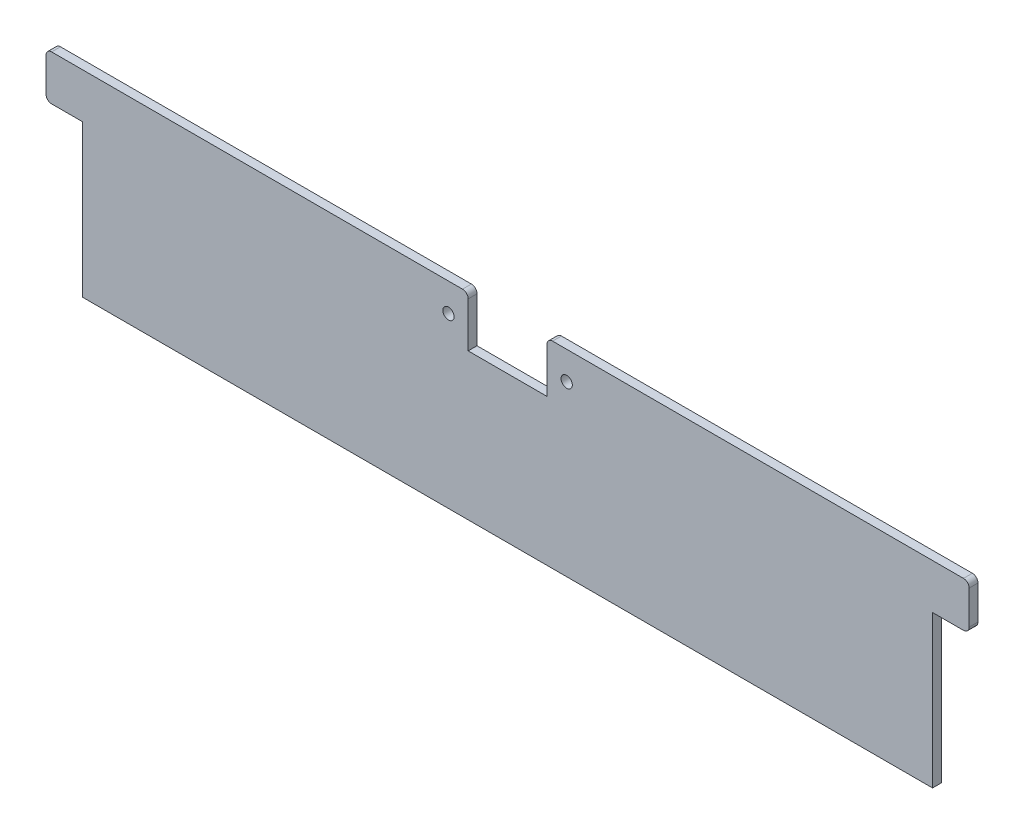
ISO-10303-21;
HEADER;
FILE_DESCRIPTION(('STEP AP214'),'2;1');
FILE_NAME('part.step','',(''),(''),'','','');
FILE_SCHEMA(('AUTOMOTIVE_DESIGN { 1 0 10303 214 1 1 1 1 }'));
ENDSEC;
DATA;
#1=APPLICATION_CONTEXT('core data for automotive mechanical design processes');
#2=APPLICATION_PROTOCOL_DEFINITION('international standard','automotive_design',2000,#1);
#3=PRODUCT_CONTEXT('',#1,'mechanical');
#4=PRODUCT('Part','Part','',(#3));
#5=PRODUCT_RELATED_PRODUCT_CATEGORY('part','',(#4));
#6=PRODUCT_DEFINITION_FORMATION('','',#4);
#7=PRODUCT_DEFINITION_CONTEXT('part definition',#1,'design');
#8=PRODUCT_DEFINITION('design','',#6,#7);
#9=PRODUCT_DEFINITION_SHAPE('','',#8);
#10=(LENGTH_UNIT() NAMED_UNIT(*) SI_UNIT(.MILLI.,.METRE.));
#11=(NAMED_UNIT(*) PLANE_ANGLE_UNIT() SI_UNIT($,.RADIAN.));
#12=(NAMED_UNIT(*) SI_UNIT($,.STERADIAN.) SOLID_ANGLE_UNIT());
#13=UNCERTAINTY_MEASURE_WITH_UNIT(LENGTH_MEASURE(1.E-05),#10,'distance_accuracy_value','');
#14=(GEOMETRIC_REPRESENTATION_CONTEXT(3) GLOBAL_UNCERTAINTY_ASSIGNED_CONTEXT((#13)) GLOBAL_UNIT_ASSIGNED_CONTEXT((#10,
#11,#12)) REPRESENTATION_CONTEXT('',''));
#15=CARTESIAN_POINT('',(0.,0.,0.));
#16=DIRECTION('',(0.,0.,1.));
#17=DIRECTION('',(1.,0.,0.));
#18=AXIS2_PLACEMENT_3D('',#15,#16,#17);
#19=CARTESIAN_POINT('',(0.,0.,2.5));
#20=DIRECTION('',(0.,0.,-1.));
#21=DIRECTION('',(-1.,0.,0.));
#22=AXIS2_PLACEMENT_3D('',#19,#20,#21);
#23=PLANE('',#22);
#24=CARTESIAN_POINT('',(-33.3375,52.3875000000003,2.5));
#25=DIRECTION('',(0.,0.,1.));
#26=DIRECTION('',(1.,0.,0.));
#27=AXIS2_PLACEMENT_3D('',#24,#25,#26);
#28=CIRCLE('',#27,3.17499999999999);
#29=CARTESIAN_POINT('',(-30.1625,52.3875000000003,2.5));
#30=VERTEX_POINT('',#29);
#31=EDGE_CURVE('E477',#30,#30,#28,.T.);
#32=ORIENTED_EDGE('',*,*,#31,.F.);
#33=EDGE_LOOP('',(#32));
#34=FACE_BOUND('',#33,.T.);
#35=DIRECTION('',(-1.,0.,0.));
#36=VECTOR('',#35,1.);
#37=CARTESIAN_POINT('',(-260.35,68.2625000000003,2.5));
#38=LINE('',#37,#36);
#39=CARTESIAN_POINT('',(257.175,68.2625000000003,2.5));
#40=VERTEX_POINT('',#39);
#41=CARTESIAN_POINT('',(25.4,68.2625000000003,2.5));
#42=VERTEX_POINT('',#41);
#43=EDGE_CURVE('E213',#40,#42,#38,.T.);
#44=ORIENTED_EDGE('',*,*,#43,.T.);
#45=CARTESIAN_POINT('',(25.4,65.0875000000003,2.5));
#46=DIRECTION('',(0.,0.,-1.));
#47=DIRECTION('',(-1.,0.,0.));
#48=AXIS2_PLACEMENT_3D('',#45,#46,#47);
#49=CIRCLE('',#48,3.175);
#50=CARTESIAN_POINT('',(22.225,65.0875000000002,2.5));
#51=VERTEX_POINT('',#50);
#52=EDGE_CURVE('E260',#42,#51,#49,.F.);
#53=ORIENTED_EDGE('',*,*,#52,.T.);
#54=DIRECTION('',(0.,1.,0.));
#55=VECTOR('',#54,1.);
#56=CARTESIAN_POINT('',(22.225,39.6875000000002,2.5));
#57=LINE('',#56,#55);
#58=CARTESIAN_POINT('',(22.225,39.6875000000002,2.5));
#59=VERTEX_POINT('',#58);
#60=EDGE_CURVE('E186',#59,#51,#57,.T.);
#61=ORIENTED_EDGE('',*,*,#60,.F.);
#62=DIRECTION('',(1.,0.,0.));
#63=VECTOR('',#62,1.);
#64=CARTESIAN_POINT('',(-22.225,39.6875000000002,2.5));
#65=LINE('',#64,#63);
#66=CARTESIAN_POINT('',(-22.225,39.6875000000002,2.5));
#67=VERTEX_POINT('',#66);
#68=EDGE_CURVE('E166',#67,#59,#65,.T.);
#69=ORIENTED_EDGE('',*,*,#68,.F.);
#70=DIRECTION('',(0.,-1.,0.));
#71=VECTOR('',#70,1.);
#72=CARTESIAN_POINT('',(-22.225,39.6875000000002,2.5));
#73=LINE('',#72,#71);
#74=CARTESIAN_POINT('',(-22.225,65.0875000000002,2.5));
#75=VERTEX_POINT('',#74);
#76=EDGE_CURVE('E188',#75,#67,#73,.T.);
#77=ORIENTED_EDGE('',*,*,#76,.F.);
#78=CARTESIAN_POINT('',(-25.4,65.0875000000003,2.5));
#79=DIRECTION('',(0.,0.,-1.));
#80=DIRECTION('',(-1.,0.,0.));
#81=AXIS2_PLACEMENT_3D('',#78,#79,#80);
#82=CIRCLE('',#81,3.175);
#83=CARTESIAN_POINT('',(-25.4,68.2625000000003,2.5));
#84=VERTEX_POINT('',#83);
#85=EDGE_CURVE('E258',#75,#84,#82,.F.);
#86=ORIENTED_EDGE('',*,*,#85,.T.);
#87=CARTESIAN_POINT('',(-257.175,68.2625000000003,2.5));
#88=VERTEX_POINT('',#87);
#89=EDGE_CURVE('E210',#84,#88,#38,.T.);
#90=ORIENTED_EDGE('',*,*,#89,.T.);
#91=CARTESIAN_POINT('',(-257.175,65.0875000000003,2.5));
#92=DIRECTION('',(0.,0.,-1.));
#93=DIRECTION('',(-1.,0.,0.));
#94=AXIS2_PLACEMENT_3D('',#91,#92,#93);
#95=CIRCLE('',#94,3.175);
#96=CARTESIAN_POINT('',(-260.35,65.0875000000003,2.5));
#97=VERTEX_POINT('',#96);
#98=EDGE_CURVE('E254',#88,#97,#95,.F.);
#99=ORIENTED_EDGE('',*,*,#98,.T.);
#100=DIRECTION('',(0.,-1.,0.));
#101=VECTOR('',#100,1.);
#102=CARTESIAN_POINT('',(-260.35,42.8625000000003,2.5));
#103=LINE('',#102,#101);
#104=CARTESIAN_POINT('',(-260.35,46.0375000000002,2.5));
#105=VERTEX_POINT('',#104);
#106=EDGE_CURVE('E192',#97,#105,#103,.T.);
#107=ORIENTED_EDGE('',*,*,#106,.T.);
#108=CARTESIAN_POINT('',(-257.175,46.0375000000002,2.5));
#109=DIRECTION('',(0.,0.,-1.));
#110=DIRECTION('',(-1.,0.,0.));
#111=AXIS2_PLACEMENT_3D('',#108,#109,#110);
#112=CIRCLE('',#111,3.175);
#113=CARTESIAN_POINT('',(-257.175,42.8625000000002,2.5));
#114=VERTEX_POINT('',#113);
#115=EDGE_CURVE('E256',#105,#114,#112,.F.);
#116=ORIENTED_EDGE('',*,*,#115,.T.);
#117=DIRECTION('',(1.,0.,0.));
#118=VECTOR('',#117,1.);
#119=CARTESIAN_POINT('',(-239.7125,42.8625,2.5));
#120=LINE('',#119,#118);
#121=CARTESIAN_POINT('',(-239.7125,42.8625,2.5));
#122=VERTEX_POINT('',#121);
#123=EDGE_CURVE('E195',#114,#122,#120,.T.);
#124=ORIENTED_EDGE('',*,*,#123,.T.);
#125=DIRECTION('',(0.,-1.,0.));
#126=VECTOR('',#125,1.);
#127=CARTESIAN_POINT('',(-239.7125,-42.8625,2.5));
#128=LINE('',#127,#126);
#129=CARTESIAN_POINT('',(-239.7125,-42.8625,2.5));
#130=VERTEX_POINT('',#129);
#131=EDGE_CURVE('E198',#122,#130,#128,.T.);
#132=ORIENTED_EDGE('',*,*,#131,.T.);
#133=DIRECTION('',(1.,0.,0.));
#134=VECTOR('',#133,1.);
#135=CARTESIAN_POINT('',(239.7125,-42.8625,2.5));
#136=LINE('',#135,#134);
#137=CARTESIAN_POINT('',(239.7125,-42.8625,2.5));
#138=VERTEX_POINT('',#137);
#139=EDGE_CURVE('E200',#130,#138,#136,.T.);
#140=ORIENTED_EDGE('',*,*,#139,.T.);
#141=DIRECTION('',(0.,1.,0.));
#142=VECTOR('',#141,1.);
#143=CARTESIAN_POINT('',(239.7125,42.8625,2.5));
#144=LINE('',#143,#142);
#145=CARTESIAN_POINT('',(239.7125,42.8625,2.5));
#146=VERTEX_POINT('',#145);
#147=EDGE_CURVE('E202',#138,#146,#144,.T.);
#148=ORIENTED_EDGE('',*,*,#147,.T.);
#149=DIRECTION('',(1.,0.,0.));
#150=VECTOR('',#149,1.);
#151=CARTESIAN_POINT('',(260.35,42.8625000000003,2.5));
#152=LINE('',#151,#150);
#153=CARTESIAN_POINT('',(257.175,42.8625000000002,2.5));
#154=VERTEX_POINT('',#153);
#155=EDGE_CURVE('E204',#146,#154,#152,.T.);
#156=ORIENTED_EDGE('',*,*,#155,.T.);
#157=CARTESIAN_POINT('',(257.175,46.0375000000002,2.5));
#158=DIRECTION('',(0.,0.,-1.));
#159=DIRECTION('',(-1.,0.,0.));
#160=AXIS2_PLACEMENT_3D('',#157,#158,#159);
#161=CIRCLE('',#160,3.175);
#162=CARTESIAN_POINT('',(260.35,46.0375000000002,2.5));
#163=VERTEX_POINT('',#162);
#164=EDGE_CURVE('E250',#154,#163,#161,.F.);
#165=ORIENTED_EDGE('',*,*,#164,.T.);
#166=DIRECTION('',(0.,1.,0.));
#167=VECTOR('',#166,1.);
#168=CARTESIAN_POINT('',(260.35,68.2625000000003,2.5));
#169=LINE('',#168,#167);
#170=CARTESIAN_POINT('',(260.35,65.0875000000003,2.5));
#171=VERTEX_POINT('',#170);
#172=EDGE_CURVE('E207',#163,#171,#169,.T.);
#173=ORIENTED_EDGE('',*,*,#172,.T.);
#174=CARTESIAN_POINT('',(257.175,65.0875000000003,2.5));
#175=DIRECTION('',(0.,0.,-1.));
#176=DIRECTION('',(-1.,0.,0.));
#177=AXIS2_PLACEMENT_3D('',#174,#175,#176);
#178=CIRCLE('',#177,3.175);
#179=EDGE_CURVE('E252',#171,#40,#178,.F.);
#180=ORIENTED_EDGE('',*,*,#179,.T.);
#181=EDGE_LOOP('',(#44,#53,#61,#69,#77,#86,#90,#99,#107,#116,#124,#132,#140,#148,#156,#165,#173,#180));
#182=FACE_BOUND('',#181,.T.);
#183=CARTESIAN_POINT('',(33.3375,52.3875000000003,2.5));
#184=DIRECTION('',(0.,0.,1.));
#185=DIRECTION('',(1.,0.,0.));
#186=AXIS2_PLACEMENT_3D('',#183,#184,#185);
#187=CIRCLE('',#186,3.17499999999999);
#188=CARTESIAN_POINT('',(36.5125,52.3875000000003,2.5));
#189=VERTEX_POINT('',#188);
#190=EDGE_CURVE('E479',#189,#189,#187,.T.);
#191=ORIENTED_EDGE('',*,*,#190,.F.);
#192=EDGE_LOOP('',(#191));
#193=FACE_BOUND('',#192,.T.);
#194=ADVANCED_FACE('F34',(#34,#182,#193),#23,.F.);
#195=CARTESIAN_POINT('',(-260.35,68.2625000000003,2.5));
#196=DIRECTION('',(0.,-1.,0.));
#197=DIRECTION('',(0.,0.,-1.));
#198=AXIS2_PLACEMENT_3D('',#195,#196,#197);
#199=PLANE('',#198);
#200=DIRECTION('',(-1.,0.,0.));
#201=VECTOR('',#200,1.);
#202=CARTESIAN_POINT('',(-260.35,68.2625000000003,-2.5));
#203=LINE('',#202,#201);
#204=CARTESIAN_POINT('',(257.175,68.2625000000003,-2.5));
#205=VERTEX_POINT('',#204);
#206=CARTESIAN_POINT('',(25.4,68.2625000000003,-2.5));
#207=VERTEX_POINT('',#206);
#208=EDGE_CURVE('E196',#205,#207,#203,.T.);
#209=ORIENTED_EDGE('',*,*,#208,.T.);
#210=DIRECTION('',(0.,0.,1.));
#211=VECTOR('',#210,1.);
#212=CARTESIAN_POINT('',(25.4,68.2625000000003,2.5));
#213=LINE('',#212,#211);
#214=EDGE_CURVE('E247',#207,#42,#213,.T.);
#215=ORIENTED_EDGE('',*,*,#214,.T.);
#216=ORIENTED_EDGE('',*,*,#43,.F.);
#217=DIRECTION('',(0.,0.,-1.));
#218=VECTOR('',#217,1.);
#219=CARTESIAN_POINT('',(257.175,68.2625000000003,2.5));
#220=LINE('',#219,#218);
#221=EDGE_CURVE('E244',#40,#205,#220,.T.);
#222=ORIENTED_EDGE('',*,*,#221,.T.);
#223=EDGE_LOOP('',(#209,#215,#216,#222));
#224=FACE_BOUND('',#223,.T.);
#225=ADVANCED_FACE('F308',(#224),#199,.F.);
#226=CARTESIAN_POINT('',(-260.35,42.8625000000003,2.5));
#227=DIRECTION('',(1.,0.,0.));
#228=DIRECTION('',(0.,0.,-1.));
#229=AXIS2_PLACEMENT_3D('',#226,#227,#228);
#230=PLANE('',#229);
#231=DIRECTION('',(0.,-1.,0.));
#232=VECTOR('',#231,1.);
#233=CARTESIAN_POINT('',(-260.35,42.8625000000003,-2.5));
#234=LINE('',#233,#232);
#235=CARTESIAN_POINT('',(-260.35,65.0875000000003,-2.5));
#236=VERTEX_POINT('',#235);
#237=CARTESIAN_POINT('',(-260.35,46.0375000000002,-2.5));
#238=VERTEX_POINT('',#237);
#239=EDGE_CURVE('E170',#236,#238,#234,.T.);
#240=ORIENTED_EDGE('',*,*,#239,.T.);
#241=DIRECTION('',(0.,0.,-1.));
#242=VECTOR('',#241,1.);
#243=CARTESIAN_POINT('',(-260.35,46.0375000000002,2.5));
#244=LINE('',#243,#242);
#245=EDGE_CURVE('E286',#238,#105,#244,.F.);
#246=ORIENTED_EDGE('',*,*,#245,.T.);
#247=ORIENTED_EDGE('',*,*,#106,.F.);
#248=DIRECTION('',(0.,0.,-1.));
#249=VECTOR('',#248,1.);
#250=CARTESIAN_POINT('',(-260.35,65.0875000000003,2.5));
#251=LINE('',#250,#249);
#252=EDGE_CURVE('E283',#97,#236,#251,.T.);
#253=ORIENTED_EDGE('',*,*,#252,.T.);
#254=EDGE_LOOP('',(#240,#246,#247,#253));
#255=FACE_BOUND('',#254,.T.);
#256=ADVANCED_FACE('F329',(#255),#230,.F.);
#257=CARTESIAN_POINT('',(-239.7125,42.8625,2.5));
#258=DIRECTION('',(0.,1.,0.));
#259=DIRECTION('',(-1.,0.,0.));
#260=AXIS2_PLACEMENT_3D('',#257,#258,#259);
#261=PLANE('',#260);
#262=ORIENTED_EDGE('',*,*,#123,.F.);
#263=DIRECTION('',(0.,0.,-1.));
#264=VECTOR('',#263,1.);
#265=CARTESIAN_POINT('',(-257.175,42.8625000000002,2.5));
#266=LINE('',#265,#264);
#267=CARTESIAN_POINT('',(-257.175,42.8625000000002,-2.5));
#268=VERTEX_POINT('',#267);
#269=EDGE_CURVE('E280',#114,#268,#266,.T.);
#270=ORIENTED_EDGE('',*,*,#269,.T.);
#271=DIRECTION('',(1.,0.,0.));
#272=VECTOR('',#271,1.);
#273=CARTESIAN_POINT('',(-239.7125,42.8625,-2.5));
#274=LINE('',#273,#272);
#275=CARTESIAN_POINT('',(-239.7125,42.8625,-2.5));
#276=VERTEX_POINT('',#275);
#277=EDGE_CURVE('E216',#268,#276,#274,.T.);
#278=ORIENTED_EDGE('',*,*,#277,.T.);
#279=DIRECTION('',(0.,0.,-1.));
#280=VECTOR('',#279,1.);
#281=CARTESIAN_POINT('',(-239.7125,42.8625,2.5));
#282=LINE('',#281,#280);
#283=EDGE_CURVE('E241',#122,#276,#282,.T.);
#284=ORIENTED_EDGE('',*,*,#283,.F.);
#285=EDGE_LOOP('',(#262,#270,#278,#284));
#286=FACE_BOUND('',#285,.T.);
#287=ADVANCED_FACE('F339',(#286),#261,.F.);
#288=CARTESIAN_POINT('',(-239.7125,-42.8625,2.5));
#289=DIRECTION('',(1.,0.,0.));
#290=DIRECTION('',(0.,0.,-1.));
#291=AXIS2_PLACEMENT_3D('',#288,#289,#290);
#292=PLANE('',#291);
#293=DIRECTION('',(0.,-1.,0.));
#294=VECTOR('',#293,1.);
#295=CARTESIAN_POINT('',(-239.7125,-42.8625,-2.5));
#296=LINE('',#295,#294);
#297=CARTESIAN_POINT('',(-239.7125,-42.8625,-2.5));
#298=VERTEX_POINT('',#297);
#299=EDGE_CURVE('E218',#276,#298,#296,.T.);
#300=ORIENTED_EDGE('',*,*,#299,.T.);
#301=DIRECTION('',(0.,0.,-1.));
#302=VECTOR('',#301,1.);
#303=CARTESIAN_POINT('',(-239.7125,-42.8625,2.5));
#304=LINE('',#303,#302);
#305=EDGE_CURVE('E238',#130,#298,#304,.T.);
#306=ORIENTED_EDGE('',*,*,#305,.F.);
#307=ORIENTED_EDGE('',*,*,#131,.F.);
#308=ORIENTED_EDGE('',*,*,#283,.T.);
#309=EDGE_LOOP('',(#300,#306,#307,#308));
#310=FACE_BOUND('',#309,.T.);
#311=ADVANCED_FACE('F346',(#310),#292,.F.);
#312=CARTESIAN_POINT('',(239.7125,-42.8625,2.5));
#313=DIRECTION('',(0.,1.,0.));
#314=DIRECTION('',(0.,0.,1.));
#315=AXIS2_PLACEMENT_3D('',#312,#313,#314);
#316=PLANE('',#315);
#317=DIRECTION('',(1.,0.,0.));
#318=VECTOR('',#317,1.);
#319=CARTESIAN_POINT('',(239.7125,-42.8625,-2.5));
#320=LINE('',#319,#318);
#321=CARTESIAN_POINT('',(239.7125,-42.8625,-2.5));
#322=VERTEX_POINT('',#321);
#323=EDGE_CURVE('E220',#298,#322,#320,.T.);
#324=ORIENTED_EDGE('',*,*,#323,.T.);
#325=DIRECTION('',(0.,0.,-1.));
#326=VECTOR('',#325,1.);
#327=CARTESIAN_POINT('',(239.7125,-42.8625,2.5));
#328=LINE('',#327,#326);
#329=EDGE_CURVE('E235',#138,#322,#328,.T.);
#330=ORIENTED_EDGE('',*,*,#329,.F.);
#331=ORIENTED_EDGE('',*,*,#139,.F.);
#332=ORIENTED_EDGE('',*,*,#305,.T.);
#333=EDGE_LOOP('',(#324,#330,#331,#332));
#334=FACE_BOUND('',#333,.T.);
#335=ADVANCED_FACE('F349',(#334),#316,.F.);
#336=CARTESIAN_POINT('',(239.7125,42.8625,2.5));
#337=DIRECTION('',(-1.,0.,0.));
#338=DIRECTION('',(0.,0.,1.));
#339=AXIS2_PLACEMENT_3D('',#336,#337,#338);
#340=PLANE('',#339);
#341=DIRECTION('',(0.,1.,0.));
#342=VECTOR('',#341,1.);
#343=CARTESIAN_POINT('',(239.7125,42.8625,-2.5));
#344=LINE('',#343,#342);
#345=CARTESIAN_POINT('',(239.7125,42.8625,-2.5));
#346=VERTEX_POINT('',#345);
#347=EDGE_CURVE('E222',#322,#346,#344,.T.);
#348=ORIENTED_EDGE('',*,*,#347,.T.);
#349=DIRECTION('',(0.,0.,-1.));
#350=VECTOR('',#349,1.);
#351=CARTESIAN_POINT('',(239.7125,42.8625,2.5));
#352=LINE('',#351,#350);
#353=EDGE_CURVE('E232',#146,#346,#352,.T.);
#354=ORIENTED_EDGE('',*,*,#353,.F.);
#355=ORIENTED_EDGE('',*,*,#147,.F.);
#356=ORIENTED_EDGE('',*,*,#329,.T.);
#357=EDGE_LOOP('',(#348,#354,#355,#356));
#358=FACE_BOUND('',#357,.T.);
#359=ADVANCED_FACE('F354',(#358),#340,.F.);
#360=CARTESIAN_POINT('',(260.35,42.8625000000003,2.5));
#361=DIRECTION('',(0.,1.,0.));
#362=DIRECTION('',(-1.,0.,0.));
#363=AXIS2_PLACEMENT_3D('',#360,#361,#362);
#364=PLANE('',#363);
#365=DIRECTION('',(1.,0.,0.));
#366=VECTOR('',#365,1.);
#367=CARTESIAN_POINT('',(260.35,42.8625000000003,-2.5));
#368=LINE('',#367,#366);
#369=CARTESIAN_POINT('',(257.175,42.8625000000002,-2.5));
#370=VERTEX_POINT('',#369);
#371=EDGE_CURVE('E224',#346,#370,#368,.T.);
#372=ORIENTED_EDGE('',*,*,#371,.T.);
#373=DIRECTION('',(0.,0.,-1.));
#374=VECTOR('',#373,1.);
#375=CARTESIAN_POINT('',(257.175,42.8625000000002,2.5));
#376=LINE('',#375,#374);
#377=EDGE_CURVE('E11',#370,#154,#376,.F.);
#378=ORIENTED_EDGE('',*,*,#377,.T.);
#379=ORIENTED_EDGE('',*,*,#155,.F.);
#380=ORIENTED_EDGE('',*,*,#353,.T.);
#381=EDGE_LOOP('',(#372,#378,#379,#380));
#382=FACE_BOUND('',#381,.T.);
#383=ADVANCED_FACE('F360',(#382),#364,.F.);
#384=CARTESIAN_POINT('',(260.35,68.2625000000003,2.5));
#385=DIRECTION('',(-1.,0.,0.));
#386=DIRECTION('',(0.,0.,1.));
#387=AXIS2_PLACEMENT_3D('',#384,#385,#386);
#388=PLANE('',#387);
#389=DIRECTION('',(0.,1.,0.));
#390=VECTOR('',#389,1.);
#391=CARTESIAN_POINT('',(260.35,68.2625000000003,-2.5));
#392=LINE('',#391,#390);
#393=CARTESIAN_POINT('',(260.35,46.0375000000002,-2.5));
#394=VERTEX_POINT('',#393);
#395=CARTESIAN_POINT('',(260.35,65.0875000000003,-2.5));
#396=VERTEX_POINT('',#395);
#397=EDGE_CURVE('E227',#394,#396,#392,.T.);
#398=ORIENTED_EDGE('',*,*,#397,.T.);
#399=DIRECTION('',(0.,0.,-1.));
#400=VECTOR('',#399,1.);
#401=CARTESIAN_POINT('',(260.35,65.0875000000003,2.5));
#402=LINE('',#401,#400);
#403=EDGE_CURVE('E42',#396,#171,#402,.F.);
#404=ORIENTED_EDGE('',*,*,#403,.T.);
#405=ORIENTED_EDGE('',*,*,#172,.F.);
#406=DIRECTION('',(0.,0.,-1.));
#407=VECTOR('',#406,1.);
#408=CARTESIAN_POINT('',(260.35,46.0375000000002,2.5));
#409=LINE('',#408,#407);
#410=EDGE_CURVE('E288',#163,#394,#409,.T.);
#411=ORIENTED_EDGE('',*,*,#410,.T.);
#412=EDGE_LOOP('',(#398,#404,#405,#411));
#413=FACE_BOUND('',#412,.T.);
#414=ADVANCED_FACE('F293',(#413),#388,.F.);
#415=ORIENTED_EDGE('',*,*,#89,.F.);
#416=DIRECTION('',(0.,0.,1.));
#417=VECTOR('',#416,1.);
#418=CARTESIAN_POINT('',(-25.4,68.2625000000003,2.5));
#419=LINE('',#418,#417);
#420=CARTESIAN_POINT('',(-25.4,68.2625000000003,-2.5));
#421=VERTEX_POINT('',#420);
#422=EDGE_CURVE('E278',#84,#421,#419,.F.);
#423=ORIENTED_EDGE('',*,*,#422,.T.);
#424=CARTESIAN_POINT('',(-257.175,68.2625000000003,-2.5));
#425=VERTEX_POINT('',#424);
#426=EDGE_CURVE('E230',#421,#425,#203,.T.);
#427=ORIENTED_EDGE('',*,*,#426,.T.);
#428=DIRECTION('',(0.,0.,-1.));
#429=VECTOR('',#428,1.);
#430=CARTESIAN_POINT('',(-257.175,68.2625000000003,2.5));
#431=LINE('',#430,#429);
#432=EDGE_CURVE('E276',#425,#88,#431,.F.);
#433=ORIENTED_EDGE('',*,*,#432,.T.);
#434=EDGE_LOOP('',(#415,#423,#427,#433));
#435=FACE_BOUND('',#434,.T.);
#436=ADVANCED_FACE('F321',(#435),#199,.F.);
#437=CARTESIAN_POINT('',(0.,0.,-2.5));
#438=DIRECTION('',(0.,0.,-1.));
#439=DIRECTION('',(-1.,0.,0.));
#440=AXIS2_PLACEMENT_3D('',#437,#438,#439);
#441=PLANE('',#440);
#442=CARTESIAN_POINT('',(-33.3375,52.3875000000003,-2.5));
#443=DIRECTION('',(0.,0.,1.));
#444=DIRECTION('',(1.,0.,0.));
#445=AXIS2_PLACEMENT_3D('',#442,#443,#444);
#446=CIRCLE('',#445,3.175);
#447=CARTESIAN_POINT('',(-30.1625,52.3875000000003,-2.5));
#448=VERTEX_POINT('',#447);
#449=EDGE_CURVE('E475',#448,#448,#446,.T.);
#450=ORIENTED_EDGE('',*,*,#449,.T.);
#451=EDGE_LOOP('',(#450));
#452=FACE_BOUND('',#451,.T.);
#453=CARTESIAN_POINT('',(33.3375,52.3875000000003,-2.5));
#454=DIRECTION('',(0.,0.,1.));
#455=DIRECTION('',(1.,0.,0.));
#456=AXIS2_PLACEMENT_3D('',#453,#454,#455);
#457=CIRCLE('',#456,3.175);
#458=CARTESIAN_POINT('',(36.5125,52.3875000000003,-2.5));
#459=VERTEX_POINT('',#458);
#460=EDGE_CURVE('E189',#459,#459,#457,.T.);
#461=ORIENTED_EDGE('',*,*,#460,.T.);
#462=EDGE_LOOP('',(#461));
#463=FACE_BOUND('',#462,.T.);
#464=DIRECTION('',(0.,1.,0.));
#465=VECTOR('',#464,1.);
#466=CARTESIAN_POINT('',(22.225,39.6875000000002,-2.5));
#467=LINE('',#466,#465);
#468=CARTESIAN_POINT('',(22.225,39.6875000000002,-2.5));
#469=VERTEX_POINT('',#468);
#470=CARTESIAN_POINT('',(22.225,65.0875000000002,-2.5));
#471=VERTEX_POINT('',#470);
#472=EDGE_CURVE('E174',#469,#471,#467,.T.);
#473=ORIENTED_EDGE('',*,*,#472,.T.);
#474=CARTESIAN_POINT('',(25.4,65.0875000000003,-2.5));
#475=DIRECTION('',(0.,0.,-1.));
#476=DIRECTION('',(-1.,0.,0.));
#477=AXIS2_PLACEMENT_3D('',#474,#475,#476);
#478=CIRCLE('',#477,3.175);
#479=EDGE_CURVE('E271',#471,#207,#478,.T.);
#480=ORIENTED_EDGE('',*,*,#479,.T.);
#481=ORIENTED_EDGE('',*,*,#208,.F.);
#482=CARTESIAN_POINT('',(257.175,65.0875000000003,-2.5));
#483=DIRECTION('',(0.,0.,-1.));
#484=DIRECTION('',(-1.,0.,0.));
#485=AXIS2_PLACEMENT_3D('',#482,#483,#484);
#486=CIRCLE('',#485,3.175);
#487=EDGE_CURVE('E265',#205,#396,#486,.T.);
#488=ORIENTED_EDGE('',*,*,#487,.T.);
#489=ORIENTED_EDGE('',*,*,#397,.F.);
#490=CARTESIAN_POINT('',(257.175,46.0375000000002,-2.5));
#491=DIRECTION('',(0.,0.,-1.));
#492=DIRECTION('',(-1.,0.,0.));
#493=AXIS2_PLACEMENT_3D('',#490,#491,#492);
#494=CIRCLE('',#493,3.175);
#495=EDGE_CURVE('E263',#394,#370,#494,.T.);
#496=ORIENTED_EDGE('',*,*,#495,.T.);
#497=ORIENTED_EDGE('',*,*,#371,.F.);
#498=ORIENTED_EDGE('',*,*,#347,.F.);
#499=ORIENTED_EDGE('',*,*,#323,.F.);
#500=ORIENTED_EDGE('',*,*,#299,.F.);
#501=ORIENTED_EDGE('',*,*,#277,.F.);
#502=CARTESIAN_POINT('',(-257.175,46.0375000000002,-2.5));
#503=DIRECTION('',(0.,0.,-1.));
#504=DIRECTION('',(-1.,0.,0.));
#505=AXIS2_PLACEMENT_3D('',#502,#503,#504);
#506=CIRCLE('',#505,3.175);
#507=EDGE_CURVE('E268',#268,#238,#506,.T.);
#508=ORIENTED_EDGE('',*,*,#507,.T.);
#509=ORIENTED_EDGE('',*,*,#239,.F.);
#510=CARTESIAN_POINT('',(-257.175,65.0875000000003,-2.5));
#511=DIRECTION('',(0.,0.,-1.));
#512=DIRECTION('',(-1.,0.,0.));
#513=AXIS2_PLACEMENT_3D('',#510,#511,#512);
#514=CIRCLE('',#513,3.175);
#515=EDGE_CURVE('E55',#236,#425,#514,.T.);
#516=ORIENTED_EDGE('',*,*,#515,.T.);
#517=ORIENTED_EDGE('',*,*,#426,.F.);
#518=CARTESIAN_POINT('',(-25.4,65.0875000000003,-2.5));
#519=DIRECTION('',(0.,0.,-1.));
#520=DIRECTION('',(-1.,0.,0.));
#521=AXIS2_PLACEMENT_3D('',#518,#519,#520);
#522=CIRCLE('',#521,3.175);
#523=CARTESIAN_POINT('',(-22.225,65.0875000000002,-2.5));
#524=VERTEX_POINT('',#523);
#525=EDGE_CURVE('E49',#421,#524,#522,.T.);
#526=ORIENTED_EDGE('',*,*,#525,.T.);
#527=DIRECTION('',(0.,-1.,0.));
#528=VECTOR('',#527,1.);
#529=CARTESIAN_POINT('',(-22.225,39.6875000000002,-2.5));
#530=LINE('',#529,#528);
#531=CARTESIAN_POINT('',(-22.225,39.6875000000002,-2.5));
#532=VERTEX_POINT('',#531);
#533=EDGE_CURVE('E179',#524,#532,#530,.T.);
#534=ORIENTED_EDGE('',*,*,#533,.T.);
#535=DIRECTION('',(1.,0.,0.));
#536=VECTOR('',#535,1.);
#537=CARTESIAN_POINT('',(-22.225,39.6875000000002,-2.5));
#538=LINE('',#537,#536);
#539=EDGE_CURVE('E163',#532,#469,#538,.T.);
#540=ORIENTED_EDGE('',*,*,#539,.T.);
#541=EDGE_LOOP('',(#473,#480,#481,#488,#489,#496,#497,#498,#499,#500,#501,#508,#509,#516,#517,
#526,#534,#540));
#542=FACE_BOUND('',#541,.T.);
#543=ADVANCED_FACE('F181',(#452,#463,#542),#441,.T.);
#544=CARTESIAN_POINT('',(22.225,39.6875000000002,-2.5));
#545=DIRECTION('',(1.,0.,0.));
#546=DIRECTION('',(0.,0.,-1.));
#547=AXIS2_PLACEMENT_3D('',#544,#545,#546);
#548=PLANE('',#547);
#549=ORIENTED_EDGE('',*,*,#60,.T.);
#550=DIRECTION('',(0.,0.,1.));
#551=VECTOR('',#550,1.);
#552=CARTESIAN_POINT('',(22.225,65.0875000000003,-2.5));
#553=LINE('',#552,#551);
#554=EDGE_CURVE('E177',#51,#471,#553,.F.);
#555=ORIENTED_EDGE('',*,*,#554,.T.);
#556=ORIENTED_EDGE('',*,*,#472,.F.);
#557=DIRECTION('',(0.,0.,1.));
#558=VECTOR('',#557,1.);
#559=CARTESIAN_POINT('',(22.225,39.6875000000002,-2.5));
#560=LINE('',#559,#558);
#561=EDGE_CURVE('E158',#469,#59,#560,.T.);
#562=ORIENTED_EDGE('',*,*,#561,.T.);
#563=EDGE_LOOP('',(#549,#555,#556,#562));
#564=FACE_BOUND('',#563,.T.);
#565=ADVANCED_FACE('F175',(#564),#548,.F.);
#566=CARTESIAN_POINT('',(-22.225,39.6875000000002,-2.5));
#567=DIRECTION('',(0.,-1.,0.));
#568=DIRECTION('',(0.,0.,-1.));
#569=AXIS2_PLACEMENT_3D('',#566,#567,#568);
#570=PLANE('',#569);
#571=ORIENTED_EDGE('',*,*,#68,.T.);
#572=ORIENTED_EDGE('',*,*,#561,.F.);
#573=ORIENTED_EDGE('',*,*,#539,.F.);
#574=DIRECTION('',(0.,0.,1.));
#575=VECTOR('',#574,1.);
#576=CARTESIAN_POINT('',(-22.225,39.6875000000002,-2.5));
#577=LINE('',#576,#575);
#578=EDGE_CURVE('E171',#532,#67,#577,.T.);
#579=ORIENTED_EDGE('',*,*,#578,.T.);
#580=EDGE_LOOP('',(#571,#572,#573,#579));
#581=FACE_BOUND('',#580,.T.);
#582=ADVANCED_FACE('F160',(#581),#570,.F.);
#583=CARTESIAN_POINT('',(-22.225,39.6875000000002,-2.5));
#584=DIRECTION('',(-1.,0.,0.));
#585=DIRECTION('',(0.,0.,1.));
#586=AXIS2_PLACEMENT_3D('',#583,#584,#585);
#587=PLANE('',#586);
#588=ORIENTED_EDGE('',*,*,#533,.F.);
#589=DIRECTION('',(0.,0.,1.));
#590=VECTOR('',#589,1.);
#591=CARTESIAN_POINT('',(-22.225,65.0875000000003,-2.5));
#592=LINE('',#591,#590);
#593=EDGE_CURVE('E273',#524,#75,#592,.T.);
#594=ORIENTED_EDGE('',*,*,#593,.T.);
#595=ORIENTED_EDGE('',*,*,#76,.T.);
#596=ORIENTED_EDGE('',*,*,#578,.F.);
#597=EDGE_LOOP('',(#588,#594,#595,#596));
#598=FACE_BOUND('',#597,.T.);
#599=ADVANCED_FACE('F315',(#598),#587,.F.);
#600=CARTESIAN_POINT('',(25.4,65.0875000000003,2.5));
#601=DIRECTION('',(0.,0.,1.));
#602=DIRECTION('',(1.,0.,0.));
#603=AXIS2_PLACEMENT_3D('',#600,#601,#602);
#604=CYLINDRICAL_SURFACE('',#603,3.175);
#605=ORIENTED_EDGE('',*,*,#479,.F.);
#606=ORIENTED_EDGE('',*,*,#554,.F.);
#607=ORIENTED_EDGE('',*,*,#52,.F.);
#608=ORIENTED_EDGE('',*,*,#214,.F.);
#609=EDGE_LOOP('',(#605,#606,#607,#608));
#610=FACE_BOUND('',#609,.T.);
#611=ADVANCED_FACE('F311',(#610),#604,.T.);
#612=CARTESIAN_POINT('',(-25.4,65.0875000000003,-2.5));
#613=DIRECTION('',(0.,0.,1.));
#614=DIRECTION('',(1.,0.,0.));
#615=AXIS2_PLACEMENT_3D('',#612,#613,#614);
#616=CYLINDRICAL_SURFACE('',#615,3.175);
#617=ORIENTED_EDGE('',*,*,#525,.F.);
#618=ORIENTED_EDGE('',*,*,#422,.F.);
#619=ORIENTED_EDGE('',*,*,#85,.F.);
#620=ORIENTED_EDGE('',*,*,#593,.F.);
#621=EDGE_LOOP('',(#617,#618,#619,#620));
#622=FACE_BOUND('',#621,.T.);
#623=ADVANCED_FACE('F318',(#622),#616,.T.);
#624=CARTESIAN_POINT('',(-257.175,46.0375000000002,2.5));
#625=DIRECTION('',(0.,0.,-1.));
#626=DIRECTION('',(-1.,0.,0.));
#627=AXIS2_PLACEMENT_3D('',#624,#625,#626);
#628=CYLINDRICAL_SURFACE('',#627,3.175);
#629=ORIENTED_EDGE('',*,*,#115,.F.);
#630=ORIENTED_EDGE('',*,*,#245,.F.);
#631=ORIENTED_EDGE('',*,*,#507,.F.);
#632=ORIENTED_EDGE('',*,*,#269,.F.);
#633=EDGE_LOOP('',(#629,#630,#631,#632));
#634=FACE_BOUND('',#633,.T.);
#635=ADVANCED_FACE('F336',(#634),#628,.T.);
#636=CARTESIAN_POINT('',(-257.175,65.0875000000003,2.5));
#637=DIRECTION('',(0.,0.,-1.));
#638=DIRECTION('',(-1.,0.,0.));
#639=AXIS2_PLACEMENT_3D('',#636,#637,#638);
#640=CYLINDRICAL_SURFACE('',#639,3.175);
#641=ORIENTED_EDGE('',*,*,#98,.F.);
#642=ORIENTED_EDGE('',*,*,#432,.F.);
#643=ORIENTED_EDGE('',*,*,#515,.F.);
#644=ORIENTED_EDGE('',*,*,#252,.F.);
#645=EDGE_LOOP('',(#641,#642,#643,#644));
#646=FACE_BOUND('',#645,.T.);
#647=ADVANCED_FACE('F327',(#646),#640,.T.);
#648=CARTESIAN_POINT('',(257.175,65.0875000000003,2.5));
#649=DIRECTION('',(0.,0.,-1.));
#650=DIRECTION('',(-1.,0.,0.));
#651=AXIS2_PLACEMENT_3D('',#648,#649,#650);
#652=CYLINDRICAL_SURFACE('',#651,3.175);
#653=ORIENTED_EDGE('',*,*,#179,.F.);
#654=ORIENTED_EDGE('',*,*,#403,.F.);
#655=ORIENTED_EDGE('',*,*,#487,.F.);
#656=ORIENTED_EDGE('',*,*,#221,.F.);
#657=EDGE_LOOP('',(#653,#654,#655,#656));
#658=FACE_BOUND('',#657,.T.);
#659=ADVANCED_FACE('F304',(#658),#652,.T.);
#660=CARTESIAN_POINT('',(257.175,46.0375000000002,2.5));
#661=DIRECTION('',(0.,0.,-1.));
#662=DIRECTION('',(-1.,0.,0.));
#663=AXIS2_PLACEMENT_3D('',#660,#661,#662);
#664=CYLINDRICAL_SURFACE('',#663,3.175);
#665=ORIENTED_EDGE('',*,*,#164,.F.);
#666=ORIENTED_EDGE('',*,*,#377,.F.);
#667=ORIENTED_EDGE('',*,*,#495,.F.);
#668=ORIENTED_EDGE('',*,*,#410,.F.);
#669=EDGE_LOOP('',(#665,#666,#667,#668));
#670=FACE_BOUND('',#669,.T.);
#671=ADVANCED_FACE('F36',(#670),#664,.T.);
#672=CARTESIAN_POINT('',(33.3375,52.3875000000003,2.5));
#673=DIRECTION('',(0.,0.,1.));
#674=DIRECTION('',(1.,0.,0.));
#675=AXIS2_PLACEMENT_3D('',#672,#673,#674);
#676=CYLINDRICAL_SURFACE('',#675,3.17499999999999);
#677=ORIENTED_EDGE('',*,*,#460,.F.);
#678=EDGE_LOOP('',(#677));
#679=FACE_BOUND('',#678,.T.);
#680=ORIENTED_EDGE('',*,*,#190,.T.);
#681=EDGE_LOOP('',(#680));
#682=FACE_BOUND('',#681,.T.);
#683=ADVANCED_FACE('F448',(#679,#682),#676,.F.);
#684=CARTESIAN_POINT('',(-33.3375,52.3875000000003,2.5));
#685=DIRECTION('',(0.,0.,1.));
#686=DIRECTION('',(1.,0.,0.));
#687=AXIS2_PLACEMENT_3D('',#684,#685,#686);
#688=CYLINDRICAL_SURFACE('',#687,3.17499999999999);
#689=ORIENTED_EDGE('',*,*,#449,.F.);
#690=EDGE_LOOP('',(#689));
#691=FACE_BOUND('',#690,.T.);
#692=ORIENTED_EDGE('',*,*,#31,.T.);
#693=EDGE_LOOP('',(#692));
#694=FACE_BOUND('',#693,.T.);
#695=ADVANCED_FACE('F458',(#691,#694),#688,.F.);
#696=CLOSED_SHELL('',(#194,#225,#256,#287,#311,#335,#359,#383,#414,#436,#543,#565,#582,#599,
#611,#623,#635,#647,#659,#671,#683,#695));
#697=MANIFOLD_SOLID_BREP('B2',#696);
#698=ADVANCED_BREP_SHAPE_REPRESENTATION('',(#18,#697),#14);
#699=SHAPE_DEFINITION_REPRESENTATION(#9,#698);
ENDSEC;
END-ISO-10303-21;
